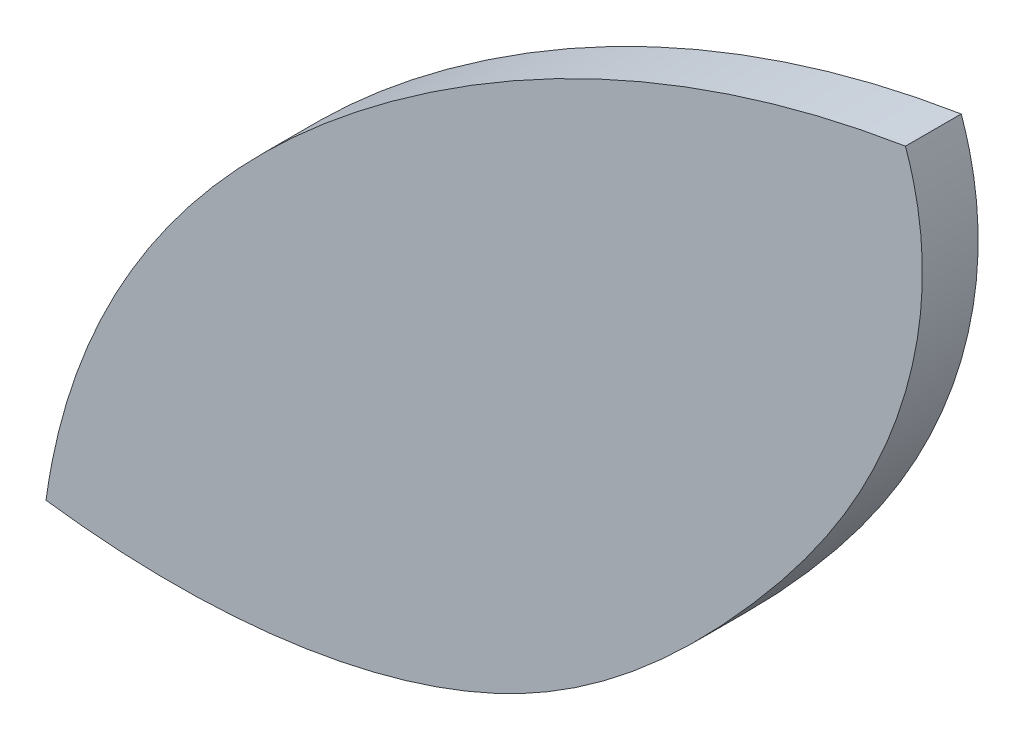
ISO-10303-21;
HEADER;
FILE_DESCRIPTION(('STEP AP214'),'2;1');
FILE_NAME('part.step','',(''),(''),'','','');
FILE_SCHEMA(('AUTOMOTIVE_DESIGN { 1 0 10303 214 1 1 1 1 }'));
ENDSEC;
DATA;
#1=APPLICATION_CONTEXT('core data for automotive mechanical design processes');
#2=APPLICATION_PROTOCOL_DEFINITION('international standard','automotive_design',2000,#1);
#3=PRODUCT_CONTEXT('',#1,'mechanical');
#4=PRODUCT('Part','Part','',(#3));
#5=PRODUCT_RELATED_PRODUCT_CATEGORY('part','',(#4));
#6=PRODUCT_DEFINITION_FORMATION('','',#4);
#7=PRODUCT_DEFINITION_CONTEXT('part definition',#1,'design');
#8=PRODUCT_DEFINITION('design','',#6,#7);
#9=PRODUCT_DEFINITION_SHAPE('','',#8);
#10=(LENGTH_UNIT() NAMED_UNIT(*) SI_UNIT(.MILLI.,.METRE.));
#11=(NAMED_UNIT(*) PLANE_ANGLE_UNIT() SI_UNIT($,.RADIAN.));
#12=(NAMED_UNIT(*) SI_UNIT($,.STERADIAN.) SOLID_ANGLE_UNIT());
#13=UNCERTAINTY_MEASURE_WITH_UNIT(LENGTH_MEASURE(1.E-05),#10,'distance_accuracy_value','');
#14=(GEOMETRIC_REPRESENTATION_CONTEXT(3) GLOBAL_UNCERTAINTY_ASSIGNED_CONTEXT((#13)) GLOBAL_UNIT_ASSIGNED_CONTEXT((#10,
#11,#12)) REPRESENTATION_CONTEXT('',''));
#15=CARTESIAN_POINT('',(0.,0.,0.));
#16=DIRECTION('',(0.,0.,1.));
#17=DIRECTION('',(1.,0.,0.));
#18=AXIS2_PLACEMENT_3D('',#15,#16,#17);
#19=CARTESIAN_POINT('',(0.,0.,3.));
#20=CARTESIAN_POINT('',(8.68950239891513,-1.18362191208477,3.));
#21=CARTESIAN_POINT('',(23.7506501852725,0.330471541162859,3.));
#22=CARTESIAN_POINT('',(37.6438343672278,13.058756394492,3.));
#23=CARTESIAN_POINT('',(46.2538933961237,24.7966842191075,3.));
#24=CARTESIAN_POINT('',(47.934931795003,34.8478222939048,3.));
#25=CARTESIAN_POINT('',(46.2264547117805,39.606646876841,3.));
#26=B_SPLINE_CURVE_WITH_KNOTS('',3,(#19,#20,#21,#22,#23,#24,#25),.UNSPECIFIED.,.F.,.F.,(4,1,1,1,
4),(0.,0.383387059858794,0.59213823907144,0.788086285039639,1.),.UNSPECIFIED.);
#27=DIRECTION('',(0.,0.,-1.));
#28=VECTOR('',#27,1.);
#29=SURFACE_OF_LINEAR_EXTRUSION('',#26,#28);
#30=CARTESIAN_POINT('',(0.,0.,0.));
#31=CARTESIAN_POINT('',(8.68950239891513,-1.18362191208477,0.));
#32=CARTESIAN_POINT('',(23.7506501852725,0.330471541162859,0.));
#33=CARTESIAN_POINT('',(37.6438343672278,13.058756394492,0.));
#34=CARTESIAN_POINT('',(46.2538933961237,24.7966842191075,0.));
#35=CARTESIAN_POINT('',(47.934931795003,34.8478222939048,0.));
#36=CARTESIAN_POINT('',(46.2264547117805,39.606646876841,0.));
#37=B_SPLINE_CURVE_WITH_KNOTS('',3,(#30,#31,#32,#33,#34,#35,#36),.UNSPECIFIED.,.F.,.F.,(4,1,1,1,
4),(0.,0.383387059858794,0.59213823907144,0.788086285039639,1.),.UNSPECIFIED.);
#38=CARTESIAN_POINT('',(0.,0.,0.));
#39=VERTEX_POINT('',#38);
#40=CARTESIAN_POINT('',(46.2264547117805,39.606646876841,0.));
#41=VERTEX_POINT('',#40);
#42=EDGE_CURVE('E65',#39,#41,#37,.T.);
#43=ORIENTED_EDGE('',*,*,#42,.T.);
#44=DIRECTION('',(0.,0.,-1.));
#45=VECTOR('',#44,1.);
#46=CARTESIAN_POINT('',(46.2264547117805,39.606646876841,3.));
#47=LINE('',#46,#45);
#48=CARTESIAN_POINT('',(46.2264547117805,39.606646876841,3.));
#49=VERTEX_POINT('',#48);
#50=EDGE_CURVE('E11',#49,#41,#47,.T.);
#51=ORIENTED_EDGE('',*,*,#50,.F.);
#52=CARTESIAN_POINT('',(0.,0.,3.));
#53=VERTEX_POINT('',#52);
#54=EDGE_CURVE('E64',#53,#49,#26,.T.);
#55=ORIENTED_EDGE('',*,*,#54,.F.);
#56=DIRECTION('',(0.,0.,-1.));
#57=VECTOR('',#56,1.);
#58=CARTESIAN_POINT('',(0.,0.,3.));
#59=LINE('',#58,#57);
#60=EDGE_CURVE('E42',#53,#39,#59,.T.);
#61=ORIENTED_EDGE('',*,*,#60,.T.);
#62=EDGE_LOOP('',(#43,#51,#55,#61));
#63=FACE_BOUND('',#62,.T.);
#64=ADVANCED_FACE('F33',(#63),#29,.F.);
#65=CARTESIAN_POINT('',(46.2264547117805,39.606646876841,3.));
#66=CARTESIAN_POINT('',(36.5777257956866,38.0554638231151,3.));
#67=CARTESIAN_POINT('',(16.3250946413144,29.4159950832889,3.));
#68=CARTESIAN_POINT('',(1.64354972929849,12.0580243164943,3.));
#69=CARTESIAN_POINT('',(0.,0.,3.));
#70=B_SPLINE_CURVE_WITH_KNOTS('',3,(#65,#66,#67,#68,#69),.UNSPECIFIED.,.F.,.F.,(4,1,4),(0.,
0.455077965932473,1.),.UNSPECIFIED.);
#71=DIRECTION('',(0.,0.,-1.));
#72=VECTOR('',#71,1.);
#73=SURFACE_OF_LINEAR_EXTRUSION('',#70,#72);
#74=CARTESIAN_POINT('',(46.2264547117805,39.606646876841,0.));
#75=CARTESIAN_POINT('',(36.5777257956866,38.0554638231151,0.));
#76=CARTESIAN_POINT('',(16.3250946413144,29.4159950832889,0.));
#77=CARTESIAN_POINT('',(1.64354972929849,12.0580243164943,0.));
#78=CARTESIAN_POINT('',(0.,0.,0.));
#79=B_SPLINE_CURVE_WITH_KNOTS('',3,(#74,#75,#76,#77,#78),.UNSPECIFIED.,.F.,.F.,(4,1,4),(0.,
0.455077965932473,1.),.UNSPECIFIED.);
#80=EDGE_CURVE('E57',#41,#39,#79,.T.);
#81=ORIENTED_EDGE('',*,*,#80,.T.);
#82=ORIENTED_EDGE('',*,*,#60,.F.);
#83=EDGE_CURVE('E49',#49,#53,#70,.T.);
#84=ORIENTED_EDGE('',*,*,#83,.F.);
#85=ORIENTED_EDGE('',*,*,#50,.T.);
#86=EDGE_LOOP('',(#81,#82,#84,#85));
#87=FACE_BOUND('',#86,.T.);
#88=ADVANCED_FACE('F60',(#87),#73,.F.);
#89=CARTESIAN_POINT('',(32.8784199432722,8.94137853223743,3.));
#90=DIRECTION('',(0.,0.,1.));
#91=DIRECTION('',(1.,0.,0.));
#92=AXIS2_PLACEMENT_3D('',#89,#90,#91);
#93=PLANE('',#92);
#94=ORIENTED_EDGE('',*,*,#54,.T.);
#95=ORIENTED_EDGE('',*,*,#83,.T.);
#96=EDGE_LOOP('',(#94,#95));
#97=FACE_BOUND('',#96,.T.);
#98=ADVANCED_FACE('F92',(#97),#93,.T.);
#99=CARTESIAN_POINT('',(32.8784199432722,8.94137853223743,0.));
#100=DIRECTION('',(0.,0.,1.));
#101=DIRECTION('',(1.,0.,0.));
#102=AXIS2_PLACEMENT_3D('',#99,#100,#101);
#103=PLANE('',#102);
#104=ORIENTED_EDGE('',*,*,#42,.F.);
#105=ORIENTED_EDGE('',*,*,#80,.F.);
#106=EDGE_LOOP('',(#104,#105));
#107=FACE_BOUND('',#106,.T.);
#108=ADVANCED_FACE('F68',(#107),#103,.F.);
#109=CLOSED_SHELL('',(#64,#88,#98,#108));
#110=MANIFOLD_SOLID_BREP('B2',#109);
#111=ADVANCED_BREP_SHAPE_REPRESENTATION('',(#18,#110),#14);
#112=SHAPE_DEFINITION_REPRESENTATION(#9,#111);
ENDSEC;
END-ISO-10303-21;
